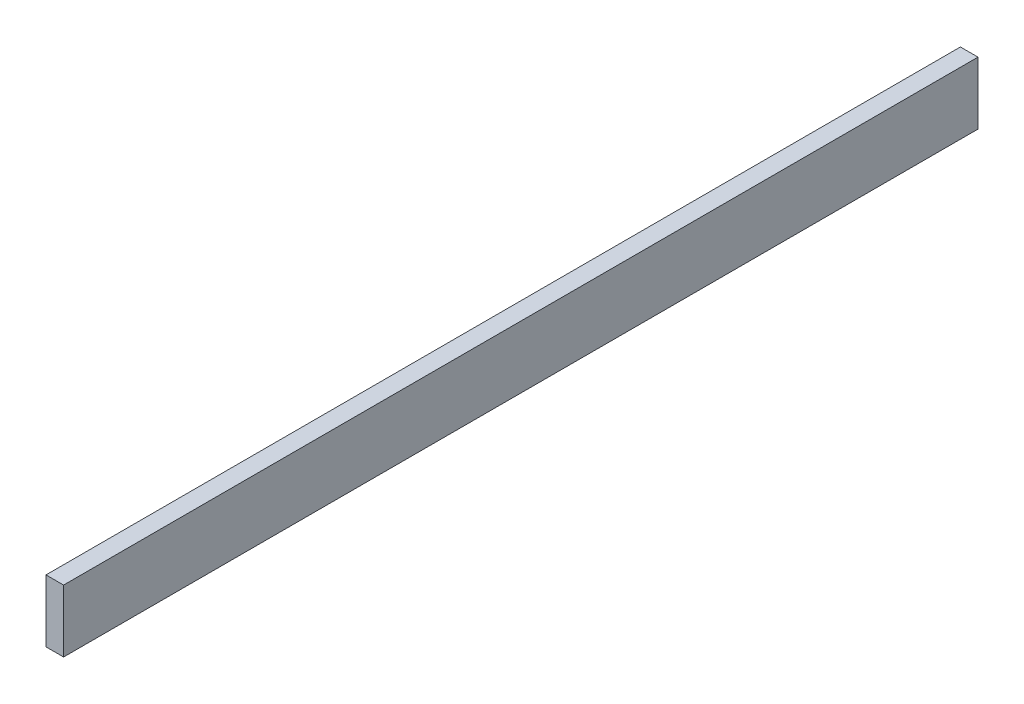
ISO-10303-21;
HEADER;
FILE_DESCRIPTION(('STEP AP214'),'2;1');
FILE_NAME('part.step','',(''),(''),'','','');
FILE_SCHEMA(('AUTOMOTIVE_DESIGN { 1 0 10303 214 1 1 1 1 }'));
ENDSEC;
DATA;
#1=APPLICATION_CONTEXT('core data for automotive mechanical design processes');
#2=APPLICATION_PROTOCOL_DEFINITION('international standard','automotive_design',2000,#1);
#3=PRODUCT_CONTEXT('',#1,'mechanical');
#4=PRODUCT('Part','Part','',(#3));
#5=PRODUCT_RELATED_PRODUCT_CATEGORY('part','',(#4));
#6=PRODUCT_DEFINITION_FORMATION('','',#4);
#7=PRODUCT_DEFINITION_CONTEXT('part definition',#1,'design');
#8=PRODUCT_DEFINITION('design','',#6,#7);
#9=PRODUCT_DEFINITION_SHAPE('','',#8);
#10=(LENGTH_UNIT() NAMED_UNIT(*) SI_UNIT(.MILLI.,.METRE.));
#11=(NAMED_UNIT(*) PLANE_ANGLE_UNIT() SI_UNIT($,.RADIAN.));
#12=(NAMED_UNIT(*) SI_UNIT($,.STERADIAN.) SOLID_ANGLE_UNIT());
#13=UNCERTAINTY_MEASURE_WITH_UNIT(LENGTH_MEASURE(1.E-05),#10,'distance_accuracy_value','');
#14=(GEOMETRIC_REPRESENTATION_CONTEXT(3) GLOBAL_UNCERTAINTY_ASSIGNED_CONTEXT((#13)) GLOBAL_UNIT_ASSIGNED_CONTEXT((#10,
#11,#12)) REPRESENTATION_CONTEXT('',''));
#15=CARTESIAN_POINT('',(0.,0.,0.));
#16=DIRECTION('',(0.,0.,1.));
#17=DIRECTION('',(1.,0.,0.));
#18=AXIS2_PLACEMENT_3D('',#15,#16,#17);
#19=CARTESIAN_POINT('',(0.,18.,-660.));
#20=DIRECTION('',(-1.,0.,0.));
#21=DIRECTION('',(0.,0.,1.));
#22=AXIS2_PLACEMENT_3D('',#19,#20,#21);
#23=PLANE('',#22);
#24=DIRECTION('',(0.,-1.,0.));
#25=VECTOR('',#24,1.);
#26=CARTESIAN_POINT('',(0.,18.,0.));
#27=LINE('',#26,#25);
#28=CARTESIAN_POINT('',(0.,63.,0.));
#29=VERTEX_POINT('',#28);
#30=CARTESIAN_POINT('',(0.,18.,0.));
#31=VERTEX_POINT('',#30);
#32=EDGE_CURVE('E103',#29,#31,#27,.T.);
#33=ORIENTED_EDGE('',*,*,#32,.F.);
#34=DIRECTION('',(0.,0.,1.));
#35=VECTOR('',#34,1.);
#36=CARTESIAN_POINT('',(0.,63.,-660.));
#37=LINE('',#36,#35);
#38=CARTESIAN_POINT('',(0.,63.,-660.));
#39=VERTEX_POINT('',#38);
#40=EDGE_CURVE('E11',#39,#29,#37,.T.);
#41=ORIENTED_EDGE('',*,*,#40,.F.);
#42=DIRECTION('',(0.,-1.,0.));
#43=VECTOR('',#42,1.);
#44=CARTESIAN_POINT('',(0.,18.,-660.));
#45=LINE('',#44,#43);
#46=CARTESIAN_POINT('',(0.,18.,-660.));
#47=VERTEX_POINT('',#46);
#48=EDGE_CURVE('E97',#39,#47,#45,.T.);
#49=ORIENTED_EDGE('',*,*,#48,.T.);
#50=DIRECTION('',(0.,0.,1.));
#51=VECTOR('',#50,1.);
#52=CARTESIAN_POINT('',(0.,18.,-660.));
#53=LINE('',#52,#51);
#54=EDGE_CURVE('E42',#47,#31,#53,.T.);
#55=ORIENTED_EDGE('',*,*,#54,.T.);
#56=EDGE_LOOP('',(#33,#41,#49,#55));
#57=FACE_BOUND('',#56,.T.);
#58=ADVANCED_FACE('F39',(#57),#23,.T.);
#59=CARTESIAN_POINT('',(0.,63.,-660.));
#60=DIRECTION('',(0.,1.,0.));
#61=DIRECTION('',(0.,0.,1.));
#62=AXIS2_PLACEMENT_3D('',#59,#60,#61);
#63=PLANE('',#62);
#64=DIRECTION('',(-1.,0.,0.));
#65=VECTOR('',#64,1.);
#66=CARTESIAN_POINT('',(0.,63.,0.));
#67=LINE('',#66,#65);
#68=CARTESIAN_POINT('',(12.7,63.,0.));
#69=VERTEX_POINT('',#68);
#70=EDGE_CURVE('E99',#69,#29,#67,.T.);
#71=ORIENTED_EDGE('',*,*,#70,.F.);
#72=DIRECTION('',(0.,0.,1.));
#73=VECTOR('',#72,1.);
#74=CARTESIAN_POINT('',(12.7,63.,-660.));
#75=LINE('',#74,#73);
#76=CARTESIAN_POINT('',(12.7,63.,-660.));
#77=VERTEX_POINT('',#76);
#78=EDGE_CURVE('E48',#77,#69,#75,.T.);
#79=ORIENTED_EDGE('',*,*,#78,.F.);
#80=DIRECTION('',(-1.,0.,0.));
#81=VECTOR('',#80,1.);
#82=CARTESIAN_POINT('',(0.,63.,-660.));
#83=LINE('',#82,#81);
#84=EDGE_CURVE('E94',#77,#39,#83,.T.);
#85=ORIENTED_EDGE('',*,*,#84,.T.);
#86=ORIENTED_EDGE('',*,*,#40,.T.);
#87=EDGE_LOOP('',(#71,#79,#85,#86));
#88=FACE_BOUND('',#87,.T.);
#89=ADVANCED_FACE('F113',(#88),#63,.T.);
#90=CARTESIAN_POINT('',(12.7,18.,-660.));
#91=DIRECTION('',(1.,0.,0.));
#92=DIRECTION('',(0.,0.,-1.));
#93=AXIS2_PLACEMENT_3D('',#90,#91,#92);
#94=PLANE('',#93);
#95=DIRECTION('',(0.,1.,0.));
#96=VECTOR('',#95,1.);
#97=CARTESIAN_POINT('',(12.7,18.,0.));
#98=LINE('',#97,#96);
#99=CARTESIAN_POINT('',(12.7,18.,0.));
#100=VERTEX_POINT('',#99);
#101=EDGE_CURVE('E89',#100,#69,#98,.T.);
#102=ORIENTED_EDGE('',*,*,#101,.F.);
#103=DIRECTION('',(0.,0.,1.));
#104=VECTOR('',#103,1.);
#105=CARTESIAN_POINT('',(12.7,18.,-660.));
#106=LINE('',#105,#104);
#107=CARTESIAN_POINT('',(12.7,18.,-660.));
#108=VERTEX_POINT('',#107);
#109=EDGE_CURVE('E84',#108,#100,#106,.T.);
#110=ORIENTED_EDGE('',*,*,#109,.F.);
#111=DIRECTION('',(0.,1.,0.));
#112=VECTOR('',#111,1.);
#113=CARTESIAN_POINT('',(12.7,18.,-660.));
#114=LINE('',#113,#112);
#115=EDGE_CURVE('E87',#108,#77,#114,.T.);
#116=ORIENTED_EDGE('',*,*,#115,.T.);
#117=ORIENTED_EDGE('',*,*,#78,.T.);
#118=EDGE_LOOP('',(#102,#110,#116,#117));
#119=FACE_BOUND('',#118,.T.);
#120=ADVANCED_FACE('F86',(#119),#94,.T.);
#121=CARTESIAN_POINT('',(0.,18.,-660.));
#122=DIRECTION('',(0.,-1.,0.));
#123=DIRECTION('',(0.,0.,-1.));
#124=AXIS2_PLACEMENT_3D('',#121,#122,#123);
#125=PLANE('',#124);
#126=DIRECTION('',(1.,0.,0.));
#127=VECTOR('',#126,1.);
#128=CARTESIAN_POINT('',(0.,18.,0.));
#129=LINE('',#128,#127);
#130=EDGE_CURVE('E106',#31,#100,#129,.T.);
#131=ORIENTED_EDGE('',*,*,#130,.F.);
#132=ORIENTED_EDGE('',*,*,#54,.F.);
#133=DIRECTION('',(1.,0.,0.));
#134=VECTOR('',#133,1.);
#135=CARTESIAN_POINT('',(0.,18.,-660.));
#136=LINE('',#135,#134);
#137=EDGE_CURVE('E93',#47,#108,#136,.T.);
#138=ORIENTED_EDGE('',*,*,#137,.T.);
#139=ORIENTED_EDGE('',*,*,#109,.T.);
#140=EDGE_LOOP('',(#131,#132,#138,#139));
#141=FACE_BOUND('',#140,.T.);
#142=ADVANCED_FACE('F96',(#141),#125,.T.);
#143=CARTESIAN_POINT('',(0.,0.,-660.));
#144=DIRECTION('',(0.,0.,-1.));
#145=DIRECTION('',(-1.,0.,0.));
#146=AXIS2_PLACEMENT_3D('',#143,#144,#145);
#147=PLANE('',#146);
#148=ORIENTED_EDGE('',*,*,#48,.F.);
#149=ORIENTED_EDGE('',*,*,#84,.F.);
#150=ORIENTED_EDGE('',*,*,#115,.F.);
#151=ORIENTED_EDGE('',*,*,#137,.F.);
#152=EDGE_LOOP('',(#148,#149,#150,#151));
#153=FACE_BOUND('',#152,.T.);
#154=ADVANCED_FACE('F92',(#153),#147,.T.);
#155=CARTESIAN_POINT('',(0.,0.,0.));
#156=DIRECTION('',(0.,0.,-1.));
#157=DIRECTION('',(-1.,0.,0.));
#158=AXIS2_PLACEMENT_3D('',#155,#156,#157);
#159=PLANE('',#158);
#160=ORIENTED_EDGE('',*,*,#32,.T.);
#161=ORIENTED_EDGE('',*,*,#130,.T.);
#162=ORIENTED_EDGE('',*,*,#101,.T.);
#163=ORIENTED_EDGE('',*,*,#70,.T.);
#164=EDGE_LOOP('',(#160,#161,#162,#163));
#165=FACE_BOUND('',#164,.T.);
#166=ADVANCED_FACE('F112',(#165),#159,.F.);
#167=CLOSED_SHELL('',(#58,#89,#120,#142,#154,#166));
#168=MANIFOLD_SOLID_BREP('B2',#167);
#169=ADVANCED_BREP_SHAPE_REPRESENTATION('',(#18,#168),#14);
#170=SHAPE_DEFINITION_REPRESENTATION(#9,#169);
ENDSEC;
END-ISO-10303-21;
